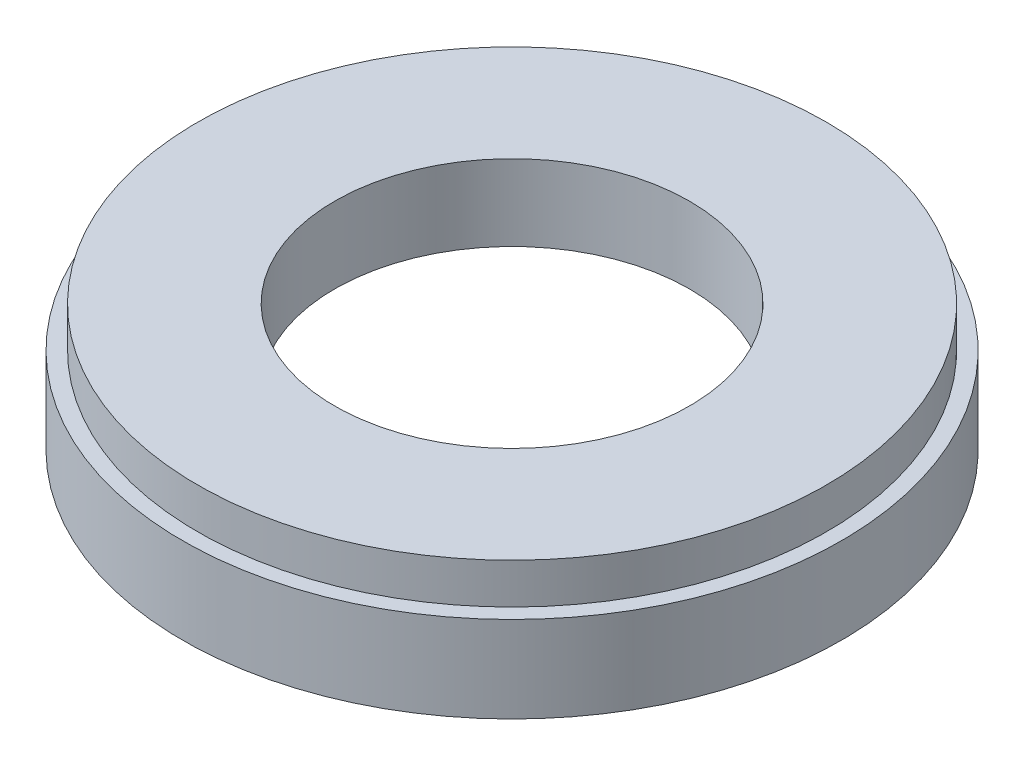
ISO-10303-21;
HEADER;
FILE_DESCRIPTION(('STEP AP214'),'2;1');
FILE_NAME('part.step','',(''),(''),'','','');
FILE_SCHEMA(('AUTOMOTIVE_DESIGN { 1 0 10303 214 1 1 1 1 }'));
ENDSEC;
DATA;
#1=APPLICATION_CONTEXT('core data for automotive mechanical design processes');
#2=APPLICATION_PROTOCOL_DEFINITION('international standard','automotive_design',2000,#1);
#3=PRODUCT_CONTEXT('',#1,'mechanical');
#4=PRODUCT('Part','Part','',(#3));
#5=PRODUCT_RELATED_PRODUCT_CATEGORY('part','',(#4));
#6=PRODUCT_DEFINITION_FORMATION('','',#4);
#7=PRODUCT_DEFINITION_CONTEXT('part definition',#1,'design');
#8=PRODUCT_DEFINITION('design','',#6,#7);
#9=PRODUCT_DEFINITION_SHAPE('','',#8);
#10=(LENGTH_UNIT() NAMED_UNIT(*) SI_UNIT(.MILLI.,.METRE.));
#11=(NAMED_UNIT(*) PLANE_ANGLE_UNIT() SI_UNIT($,.RADIAN.));
#12=(NAMED_UNIT(*) SI_UNIT($,.STERADIAN.) SOLID_ANGLE_UNIT());
#13=UNCERTAINTY_MEASURE_WITH_UNIT(LENGTH_MEASURE(1.E-05),#10,'distance_accuracy_value','');
#14=(GEOMETRIC_REPRESENTATION_CONTEXT(3) GLOBAL_UNCERTAINTY_ASSIGNED_CONTEXT((#13)) GLOBAL_UNIT_ASSIGNED_CONTEXT((#10,
#11,#12)) REPRESENTATION_CONTEXT('',''));
#15=CARTESIAN_POINT('',(0.,0.,0.));
#16=DIRECTION('',(0.,0.,1.));
#17=DIRECTION('',(1.,0.,0.));
#18=AXIS2_PLACEMENT_3D('',#15,#16,#17);
#19=CARTESIAN_POINT('',(0.,0.,0.));
#20=DIRECTION('',(0.,-1.,0.));
#21=DIRECTION('',(0.,0.,-1.));
#22=AXIS2_PLACEMENT_3D('',#19,#20,#21);
#23=PLANE('',#22);
#24=CARTESIAN_POINT('',(0.,0.,0.));
#25=DIRECTION('',(0.,-1.,0.));
#26=DIRECTION('',(0.,0.,-1.));
#27=AXIS2_PLACEMENT_3D('',#24,#25,#26);
#28=CIRCLE('',#27,35.);
#29=CARTESIAN_POINT('',(0.,0.,-35.));
#30=VERTEX_POINT('',#29);
#31=EDGE_CURVE('E74',#30,#30,#28,.T.);
#32=ORIENTED_EDGE('',*,*,#31,.F.);
#33=EDGE_LOOP('',(#32));
#34=FACE_BOUND('',#33,.T.);
#35=CARTESIAN_POINT('',(0.,0.,0.));
#36=DIRECTION('',(0.,-1.,0.));
#37=DIRECTION('',(0.,0.,-1.));
#38=AXIS2_PLACEMENT_3D('',#35,#36,#37);
#39=CIRCLE('',#38,62.);
#40=CARTESIAN_POINT('',(0.,0.,-62.));
#41=VERTEX_POINT('',#40);
#42=EDGE_CURVE('E10',#41,#41,#39,.F.);
#43=ORIENTED_EDGE('',*,*,#42,.F.);
#44=EDGE_LOOP('',(#43));
#45=FACE_BOUND('',#44,.T.);
#46=ADVANCED_FACE('F41',(#34,#45),#23,.T.);
#47=CARTESIAN_POINT('',(0.,15.,0.));
#48=DIRECTION('',(0.,1.,0.));
#49=DIRECTION('',(0.,0.,1.));
#50=AXIS2_PLACEMENT_3D('',#47,#48,#49);
#51=PLANE('',#50);
#52=CARTESIAN_POINT('',(0.,15.,0.));
#53=DIRECTION('',(0.,-1.,0.));
#54=DIRECTION('',(0.,0.,-1.));
#55=AXIS2_PLACEMENT_3D('',#52,#53,#54);
#56=CIRCLE('',#55,35.);
#57=CARTESIAN_POINT('',(0.,15.,-35.));
#58=VERTEX_POINT('',#57);
#59=EDGE_CURVE('E68',#58,#58,#56,.T.);
#60=ORIENTED_EDGE('',*,*,#59,.T.);
#61=EDGE_LOOP('',(#60));
#62=FACE_BOUND('',#61,.T.);
#63=CARTESIAN_POINT('',(0.,15.,0.));
#64=DIRECTION('',(0.,-1.,0.));
#65=DIRECTION('',(0.,0.,-1.));
#66=AXIS2_PLACEMENT_3D('',#63,#64,#65);
#67=CIRCLE('',#66,62.);
#68=CARTESIAN_POINT('',(0.,15.,-62.));
#69=VERTEX_POINT('',#68);
#70=EDGE_CURVE('E50',#69,#69,#67,.T.);
#71=ORIENTED_EDGE('',*,*,#70,.F.);
#72=EDGE_LOOP('',(#71));
#73=FACE_BOUND('',#72,.T.);
#74=ADVANCED_FACE('F97',(#62,#73),#51,.T.);
#75=CARTESIAN_POINT('',(0.,0.,0.));
#76=DIRECTION('',(0.,-1.,0.));
#77=DIRECTION('',(0.,0.,-1.));
#78=AXIS2_PLACEMENT_3D('',#75,#76,#77);
#79=CYLINDRICAL_SURFACE('',#78,62.);
#80=CARTESIAN_POINT('',(0.,6.99999999999998,0.));
#81=DIRECTION('',(0.,-1.,0.));
#82=DIRECTION('',(0.,0.,-1.));
#83=AXIS2_PLACEMENT_3D('',#80,#81,#82);
#84=CIRCLE('',#83,62.);
#85=CARTESIAN_POINT('',(0.,6.99999999999998,-62.));
#86=VERTEX_POINT('',#85);
#87=EDGE_CURVE('E57',#86,#86,#84,.T.);
#88=ORIENTED_EDGE('',*,*,#87,.F.);
#89=EDGE_LOOP('',(#88));
#90=FACE_BOUND('',#89,.T.);
#91=ORIENTED_EDGE('',*,*,#70,.T.);
#92=EDGE_LOOP('',(#91));
#93=FACE_BOUND('',#92,.T.);
#94=ADVANCED_FACE('F94',(#90,#93),#79,.T.);
#95=CARTESIAN_POINT('',(0.,6.99999999999998,0.));
#96=DIRECTION('',(0.,1.,0.));
#97=DIRECTION('',(0.,0.,1.));
#98=AXIS2_PLACEMENT_3D('',#95,#96,#97);
#99=PLANE('',#98);
#100=ORIENTED_EDGE('',*,*,#87,.T.);
#101=EDGE_LOOP('',(#100));
#102=FACE_BOUND('',#101,.T.);
#103=CARTESIAN_POINT('',(0.,6.99999999999998,0.));
#104=DIRECTION('',(0.,-1.,0.));
#105=DIRECTION('',(0.,0.,-1.));
#106=AXIS2_PLACEMENT_3D('',#103,#104,#105);
#107=CIRCLE('',#106,65.);
#108=CARTESIAN_POINT('',(0.,6.99999999999998,-65.));
#109=VERTEX_POINT('',#108);
#110=EDGE_CURVE('E81',#109,#109,#107,.T.);
#111=ORIENTED_EDGE('',*,*,#110,.F.);
#112=EDGE_LOOP('',(#111));
#113=FACE_BOUND('',#112,.T.);
#114=ADVANCED_FACE('F91',(#102,#113),#99,.T.);
#115=CARTESIAN_POINT('',(0.,0.,0.));
#116=DIRECTION('',(0.,-1.,0.));
#117=DIRECTION('',(0.,0.,-1.));
#118=AXIS2_PLACEMENT_3D('',#115,#116,#117);
#119=CYLINDRICAL_SURFACE('',#118,65.);
#120=ORIENTED_EDGE('',*,*,#110,.T.);
#121=EDGE_LOOP('',(#120));
#122=FACE_BOUND('',#121,.T.);
#123=CARTESIAN_POINT('',(0.,-10.,0.));
#124=DIRECTION('',(0.,-1.,0.));
#125=DIRECTION('',(0.,0.,-1.));
#126=AXIS2_PLACEMENT_3D('',#123,#124,#125);
#127=CIRCLE('',#126,65.);
#128=CARTESIAN_POINT('',(0.,-10.,-65.));
#129=VERTEX_POINT('',#128);
#130=EDGE_CURVE('E45',#129,#129,#127,.T.);
#131=ORIENTED_EDGE('',*,*,#130,.F.);
#132=EDGE_LOOP('',(#131));
#133=FACE_BOUND('',#132,.T.);
#134=ADVANCED_FACE('F116',(#122,#133),#119,.T.);
#135=CARTESIAN_POINT('',(0.,0.,0.));
#136=DIRECTION('',(0.,-1.,0.));
#137=DIRECTION('',(0.,0.,-1.));
#138=AXIS2_PLACEMENT_3D('',#135,#136,#137);
#139=CYLINDRICAL_SURFACE('',#138,35.);
#140=ORIENTED_EDGE('',*,*,#31,.T.);
#141=EDGE_LOOP('',(#140));
#142=FACE_BOUND('',#141,.T.);
#143=ORIENTED_EDGE('',*,*,#59,.F.);
#144=EDGE_LOOP('',(#143));
#145=FACE_BOUND('',#144,.T.);
#146=ADVANCED_FACE('F110',(#142,#145),#139,.F.);
#147=CARTESIAN_POINT('',(-65.,-10.,0.));
#148=DIRECTION('',(0.,1.,0.));
#149=DIRECTION('',(0.,0.,1.));
#150=AXIS2_PLACEMENT_3D('',#147,#148,#149);
#151=PLANE('',#150);
#152=CARTESIAN_POINT('',(0.,-10.,0.));
#153=DIRECTION('',(0.,-1.,0.));
#154=DIRECTION('',(0.,0.,-1.));
#155=AXIS2_PLACEMENT_3D('',#152,#153,#154);
#156=CIRCLE('',#155,62.);
#157=CARTESIAN_POINT('',(0.,-10.,-62.));
#158=VERTEX_POINT('',#157);
#159=EDGE_CURVE('E60',#158,#158,#156,.T.);
#160=ORIENTED_EDGE('',*,*,#159,.F.);
#161=EDGE_LOOP('',(#160));
#162=FACE_BOUND('',#161,.T.);
#163=ORIENTED_EDGE('',*,*,#130,.T.);
#164=EDGE_LOOP('',(#163));
#165=FACE_BOUND('',#164,.T.);
#166=ADVANCED_FACE('F43',(#162,#165),#151,.F.);
#167=CARTESIAN_POINT('',(0.,0.,0.));
#168=DIRECTION('',(0.,-1.,0.));
#169=DIRECTION('',(0.,0.,-1.));
#170=AXIS2_PLACEMENT_3D('',#167,#168,#169);
#171=CYLINDRICAL_SURFACE('',#170,62.);
#172=ORIENTED_EDGE('',*,*,#159,.T.);
#173=EDGE_LOOP('',(#172));
#174=FACE_BOUND('',#173,.T.);
#175=ORIENTED_EDGE('',*,*,#42,.T.);
#176=EDGE_LOOP('',(#175));
#177=FACE_BOUND('',#176,.T.);
#178=ADVANCED_FACE('F108',(#174,#177),#171,.F.);
#179=CLOSED_SHELL('',(#46,#74,#94,#114,#134,#146,#166,#178));
#180=MANIFOLD_SOLID_BREP('B2',#179);
#181=ADVANCED_BREP_SHAPE_REPRESENTATION('',(#18,#180),#14);
#182=SHAPE_DEFINITION_REPRESENTATION(#9,#181);
ENDSEC;
END-ISO-10303-21;
